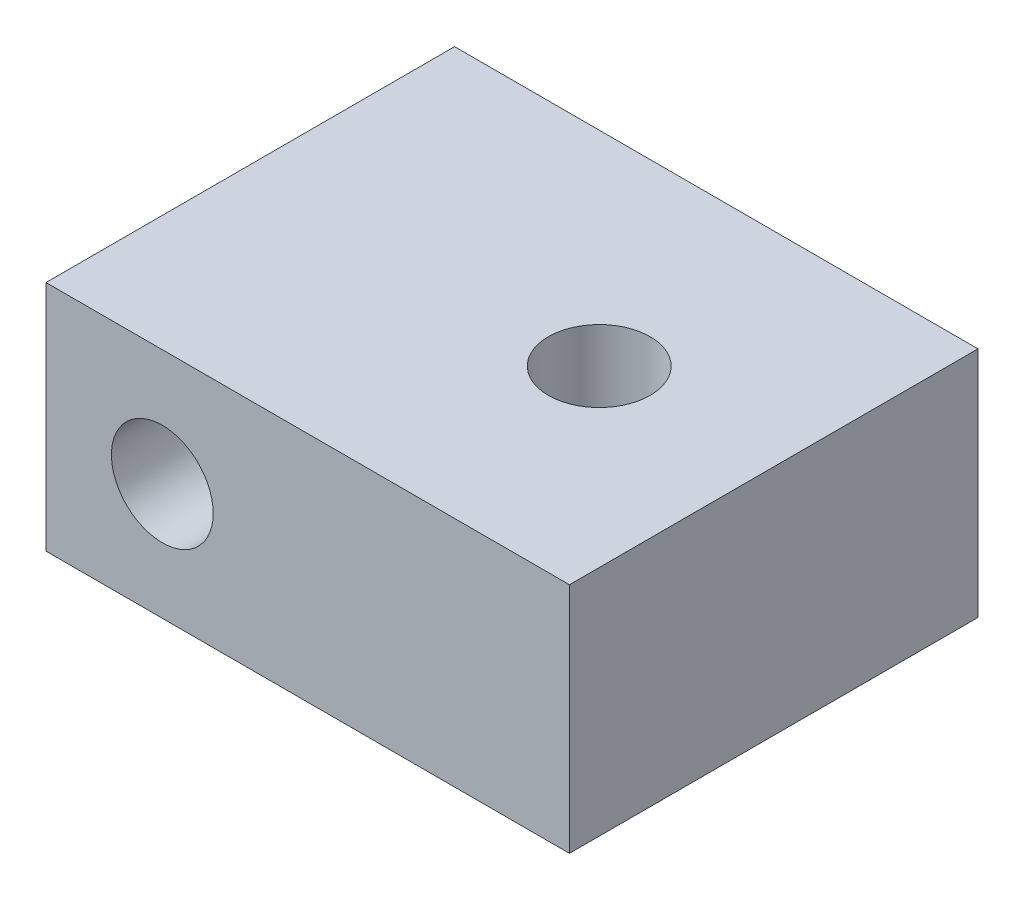
ISO-10303-21;
HEADER;
FILE_DESCRIPTION(('STEP AP214'),'2;1');
FILE_NAME('part.step','',(''),(''),'','','');
FILE_SCHEMA(('AUTOMOTIVE_DESIGN { 1 0 10303 214 1 1 1 1 }'));
ENDSEC;
DATA;
#1=APPLICATION_CONTEXT('core data for automotive mechanical design processes');
#2=APPLICATION_PROTOCOL_DEFINITION('international standard','automotive_design',2000,#1);
#3=PRODUCT_CONTEXT('',#1,'mechanical');
#4=PRODUCT('Part','Part','',(#3));
#5=PRODUCT_RELATED_PRODUCT_CATEGORY('part','',(#4));
#6=PRODUCT_DEFINITION_FORMATION('','',#4);
#7=PRODUCT_DEFINITION_CONTEXT('part definition',#1,'design');
#8=PRODUCT_DEFINITION('design','',#6,#7);
#9=PRODUCT_DEFINITION_SHAPE('','',#8);
#10=(LENGTH_UNIT() NAMED_UNIT(*) SI_UNIT(.MILLI.,.METRE.));
#11=(NAMED_UNIT(*) PLANE_ANGLE_UNIT() SI_UNIT($,.RADIAN.));
#12=(NAMED_UNIT(*) SI_UNIT($,.STERADIAN.) SOLID_ANGLE_UNIT());
#13=UNCERTAINTY_MEASURE_WITH_UNIT(LENGTH_MEASURE(1.E-05),#10,'distance_accuracy_value','');
#14=(GEOMETRIC_REPRESENTATION_CONTEXT(3) GLOBAL_UNCERTAINTY_ASSIGNED_CONTEXT((#13)) GLOBAL_UNIT_ASSIGNED_CONTEXT((#10,
#11,#12)) REPRESENTATION_CONTEXT('',''));
#15=CARTESIAN_POINT('',(0.,0.,0.));
#16=DIRECTION('',(0.,0.,1.));
#17=DIRECTION('',(1.,0.,0.));
#18=AXIS2_PLACEMENT_3D('',#15,#16,#17);
#19=CARTESIAN_POINT('',(-3.69713081377444,3.70615839354736,14.05));
#20=DIRECTION('',(1.,0.,0.));
#21=DIRECTION('',(0.,1.,0.));
#22=AXIS2_PLACEMENT_3D('',#19,#20,#21);
#23=PLANE('',#22);
#24=DIRECTION('',(0.,-1.,0.));
#25=VECTOR('',#24,1.);
#26=CARTESIAN_POINT('',(-3.69713081377444,3.70615839354736,0.));
#27=LINE('',#26,#25);
#28=CARTESIAN_POINT('',(-3.69713081377444,3.70615839354736,0.));
#29=VERTEX_POINT('',#28);
#30=CARTESIAN_POINT('',(-3.69713081377444,-4.29384160645265,0.));
#31=VERTEX_POINT('',#30);
#32=EDGE_CURVE('E81',#29,#31,#27,.T.);
#33=ORIENTED_EDGE('',*,*,#32,.T.);
#34=DIRECTION('',(0.,0.,-1.));
#35=VECTOR('',#34,1.);
#36=CARTESIAN_POINT('',(-3.69713081377444,-4.29384160645265,14.05));
#37=LINE('',#36,#35);
#38=CARTESIAN_POINT('',(-3.69713081377444,-4.29384160645265,14.05));
#39=VERTEX_POINT('',#38);
#40=EDGE_CURVE('E11',#39,#31,#37,.T.);
#41=ORIENTED_EDGE('',*,*,#40,.F.);
#42=DIRECTION('',(0.,-1.,0.));
#43=VECTOR('',#42,1.);
#44=CARTESIAN_POINT('',(-3.69713081377444,3.70615839354736,14.05));
#45=LINE('',#44,#43);
#46=CARTESIAN_POINT('',(-3.69713081377444,3.70615839354736,14.05));
#47=VERTEX_POINT('',#46);
#48=EDGE_CURVE('E108',#47,#39,#45,.T.);
#49=ORIENTED_EDGE('',*,*,#48,.F.);
#50=DIRECTION('',(0.,0.,-1.));
#51=VECTOR('',#50,1.);
#52=CARTESIAN_POINT('',(-3.69713081377444,3.70615839354736,14.05));
#53=LINE('',#52,#51);
#54=EDGE_CURVE('E41',#47,#29,#53,.T.);
#55=ORIENTED_EDGE('',*,*,#54,.T.);
#56=EDGE_LOOP('',(#33,#41,#49,#55));
#57=FACE_BOUND('',#56,.T.);
#58=ADVANCED_FACE('F33',(#57),#23,.F.);
#59=CARTESIAN_POINT('',(-3.69713081377444,-4.29384160645265,14.05));
#60=DIRECTION('',(0.,1.,0.));
#61=DIRECTION('',(0.,0.,1.));
#62=AXIS2_PLACEMENT_3D('',#59,#60,#61);
#63=PLANE('',#62);
#64=CARTESIAN_POINT('',(8.30286918622556,-4.29384160645265,7.025));
#65=DIRECTION('',(0.,1.,0.));
#66=DIRECTION('',(0.,0.,1.));
#67=AXIS2_PLACEMENT_3D('',#64,#65,#66);
#68=CIRCLE('',#67,1.75);
#69=CARTESIAN_POINT('',(8.30286918622556,-4.29384160645265,8.775));
#70=VERTEX_POINT('',#69);
#71=EDGE_CURVE('E93',#70,#70,#68,.T.);
#72=ORIENTED_EDGE('',*,*,#71,.T.);
#73=EDGE_LOOP('',(#72));
#74=FACE_BOUND('',#73,.T.);
#75=DIRECTION('',(1.,0.,0.));
#76=VECTOR('',#75,1.);
#77=CARTESIAN_POINT('',(-3.69713081377444,-4.29384160645265,0.));
#78=LINE('',#77,#76);
#79=CARTESIAN_POINT('',(14.3028691862256,-4.29384160645264,0.));
#80=VERTEX_POINT('',#79);
#81=EDGE_CURVE('E61',#31,#80,#78,.T.);
#82=ORIENTED_EDGE('',*,*,#81,.T.);
#83=DIRECTION('',(0.,0.,-1.));
#84=VECTOR('',#83,1.);
#85=CARTESIAN_POINT('',(14.3028691862256,-4.29384160645264,14.05));
#86=LINE('',#85,#84);
#87=CARTESIAN_POINT('',(14.3028691862256,-4.29384160645264,14.05));
#88=VERTEX_POINT('',#87);
#89=EDGE_CURVE('E77',#88,#80,#86,.T.);
#90=ORIENTED_EDGE('',*,*,#89,.F.);
#91=DIRECTION('',(1.,0.,0.));
#92=VECTOR('',#91,1.);
#93=CARTESIAN_POINT('',(-3.69713081377444,-4.29384160645265,14.05));
#94=LINE('',#93,#92);
#95=EDGE_CURVE('E65',#39,#88,#94,.T.);
#96=ORIENTED_EDGE('',*,*,#95,.F.);
#97=ORIENTED_EDGE('',*,*,#40,.T.);
#98=EDGE_LOOP('',(#82,#90,#96,#97));
#99=FACE_BOUND('',#98,.T.);
#100=ADVANCED_FACE('F75',(#74,#99),#63,.F.);
#101=CARTESIAN_POINT('',(-3.69713081377444,3.70615839354736,14.05));
#102=DIRECTION('',(0.,-1.,0.));
#103=DIRECTION('',(0.,0.,-1.));
#104=AXIS2_PLACEMENT_3D('',#101,#102,#103);
#105=PLANE('',#104);
#106=CARTESIAN_POINT('',(8.30286918622556,3.70615839354736,7.025));
#107=DIRECTION('',(0.,1.,0.));
#108=DIRECTION('',(0.,0.,1.));
#109=AXIS2_PLACEMENT_3D('',#106,#107,#108);
#110=CIRCLE('',#109,1.75);
#111=CARTESIAN_POINT('',(8.30286918622556,3.70615839354736,8.775));
#112=VERTEX_POINT('',#111);
#113=EDGE_CURVE('E96',#112,#112,#110,.T.);
#114=ORIENTED_EDGE('',*,*,#113,.F.);
#115=EDGE_LOOP('',(#114));
#116=FACE_BOUND('',#115,.T.);
#117=DIRECTION('',(-1.,0.,0.));
#118=VECTOR('',#117,1.);
#119=CARTESIAN_POINT('',(-3.69713081377444,3.70615839354736,0.));
#120=LINE('',#119,#118);
#121=CARTESIAN_POINT('',(14.3028691862256,3.70615839354736,0.));
#122=VERTEX_POINT('',#121);
#123=EDGE_CURVE('E80',#122,#29,#120,.T.);
#124=ORIENTED_EDGE('',*,*,#123,.T.);
#125=ORIENTED_EDGE('',*,*,#54,.F.);
#126=DIRECTION('',(-1.,0.,0.));
#127=VECTOR('',#126,1.);
#128=CARTESIAN_POINT('',(-3.69713081377444,3.70615839354736,14.05));
#129=LINE('',#128,#127);
#130=CARTESIAN_POINT('',(14.3028691862256,3.70615839354736,14.05));
#131=VERTEX_POINT('',#130);
#132=EDGE_CURVE('E49',#131,#47,#129,.T.);
#133=ORIENTED_EDGE('',*,*,#132,.F.);
#134=DIRECTION('',(0.,0.,1.));
#135=VECTOR('',#134,1.);
#136=CARTESIAN_POINT('',(14.3028691862256,3.70615839354736,0.));
#137=LINE('',#136,#135);
#138=EDGE_CURVE('E89',#122,#131,#137,.T.);
#139=ORIENTED_EDGE('',*,*,#138,.F.);
#140=EDGE_LOOP('',(#124,#125,#133,#139));
#141=FACE_BOUND('',#140,.T.);
#142=ADVANCED_FACE('F117',(#116,#141),#105,.F.);
#143=CARTESIAN_POINT('',(0.,0.,14.05));
#144=DIRECTION('',(0.,0.,1.));
#145=DIRECTION('',(1.,0.,0.));
#146=AXIS2_PLACEMENT_3D('',#143,#144,#145);
#147=PLANE('',#146);
#148=CARTESIAN_POINT('',(0.302869186225555,-0.293841606452645,14.05));
#149=DIRECTION('',(0.,0.,1.));
#150=DIRECTION('',(1.,0.,0.));
#151=AXIS2_PLACEMENT_3D('',#148,#149,#150);
#152=CIRCLE('',#151,1.75);
#153=CARTESIAN_POINT('',(2.05286918622556,-0.293841606452645,14.05));
#154=VERTEX_POINT('',#153);
#155=EDGE_CURVE('E102',#154,#154,#152,.T.);
#156=ORIENTED_EDGE('',*,*,#155,.F.);
#157=EDGE_LOOP('',(#156));
#158=FACE_BOUND('',#157,.T.);
#159=ORIENTED_EDGE('',*,*,#48,.T.);
#160=ORIENTED_EDGE('',*,*,#95,.T.);
#161=DIRECTION('',(0.,-1.,0.));
#162=VECTOR('',#161,1.);
#163=CARTESIAN_POINT('',(14.3028691862256,3.70615839354736,14.05));
#164=LINE('',#163,#162);
#165=EDGE_CURVE('E92',#131,#88,#164,.T.);
#166=ORIENTED_EDGE('',*,*,#165,.F.);
#167=ORIENTED_EDGE('',*,*,#132,.T.);
#168=EDGE_LOOP('',(#159,#160,#166,#167));
#169=FACE_BOUND('',#168,.T.);
#170=ADVANCED_FACE('F118',(#158,#169),#147,.T.);
#171=CARTESIAN_POINT('',(0.,0.,0.));
#172=DIRECTION('',(0.,0.,1.));
#173=DIRECTION('',(1.,0.,0.));
#174=AXIS2_PLACEMENT_3D('',#171,#172,#173);
#175=PLANE('',#174);
#176=CARTESIAN_POINT('',(0.302869186225555,-0.293841606452645,0.));
#177=DIRECTION('',(0.,0.,1.));
#178=DIRECTION('',(1.,0.,0.));
#179=AXIS2_PLACEMENT_3D('',#176,#177,#178);
#180=CIRCLE('',#179,1.75);
#181=CARTESIAN_POINT('',(2.05286918622556,-0.293841606452645,0.));
#182=VERTEX_POINT('',#181);
#183=EDGE_CURVE('E103',#182,#182,#180,.T.);
#184=ORIENTED_EDGE('',*,*,#183,.T.);
#185=EDGE_LOOP('',(#184));
#186=FACE_BOUND('',#185,.T.);
#187=ORIENTED_EDGE('',*,*,#32,.F.);
#188=ORIENTED_EDGE('',*,*,#123,.F.);
#189=DIRECTION('',(0.,1.,0.));
#190=VECTOR('',#189,1.);
#191=CARTESIAN_POINT('',(14.3028691862256,-4.29384160645264,0.));
#192=LINE('',#191,#190);
#193=EDGE_CURVE('E84',#80,#122,#192,.T.);
#194=ORIENTED_EDGE('',*,*,#193,.F.);
#195=ORIENTED_EDGE('',*,*,#81,.F.);
#196=EDGE_LOOP('',(#187,#188,#194,#195));
#197=FACE_BOUND('',#196,.T.);
#198=ADVANCED_FACE('F85',(#186,#197),#175,.F.);
#199=CARTESIAN_POINT('',(0.302869186225555,-0.293841606452645,0.));
#200=DIRECTION('',(0.,0.,1.));
#201=DIRECTION('',(1.,0.,0.));
#202=AXIS2_PLACEMENT_3D('',#199,#200,#201);
#203=CYLINDRICAL_SURFACE('',#202,1.75);
#204=ORIENTED_EDGE('',*,*,#183,.F.);
#205=EDGE_LOOP('',(#204));
#206=FACE_BOUND('',#205,.T.);
#207=ORIENTED_EDGE('',*,*,#155,.T.);
#208=EDGE_LOOP('',(#207));
#209=FACE_BOUND('',#208,.T.);
#210=ADVANCED_FACE('F126',(#206,#209),#203,.F.);
#211=CARTESIAN_POINT('',(14.3028691862256,0.,0.));
#212=DIRECTION('',(1.,0.,0.));
#213=DIRECTION('',(0.,1.,0.));
#214=AXIS2_PLACEMENT_3D('',#211,#212,#213);
#215=PLANE('',#214);
#216=ORIENTED_EDGE('',*,*,#89,.T.);
#217=ORIENTED_EDGE('',*,*,#193,.T.);
#218=ORIENTED_EDGE('',*,*,#138,.T.);
#219=ORIENTED_EDGE('',*,*,#165,.T.);
#220=EDGE_LOOP('',(#216,#217,#218,#219));
#221=FACE_BOUND('',#220,.T.);
#222=ADVANCED_FACE('F91',(#221),#215,.T.);
#223=CARTESIAN_POINT('',(8.30286918622556,-4.29384160645265,7.025));
#224=DIRECTION('',(0.,1.,0.));
#225=DIRECTION('',(0.,0.,1.));
#226=AXIS2_PLACEMENT_3D('',#223,#224,#225);
#227=CYLINDRICAL_SURFACE('',#226,1.75);
#228=ORIENTED_EDGE('',*,*,#71,.F.);
#229=EDGE_LOOP('',(#228));
#230=FACE_BOUND('',#229,.T.);
#231=ORIENTED_EDGE('',*,*,#113,.T.);
#232=EDGE_LOOP('',(#231));
#233=FACE_BOUND('',#232,.T.);
#234=ADVANCED_FACE('F142',(#230,#233),#227,.F.);
#235=CLOSED_SHELL('',(#58,#100,#142,#170,#198,#210,#222,#234));
#236=MANIFOLD_SOLID_BREP('B2',#235);
#237=ADVANCED_BREP_SHAPE_REPRESENTATION('',(#18,#236),#14);
#238=SHAPE_DEFINITION_REPRESENTATION(#9,#237);
ENDSEC;
END-ISO-10303-21;
